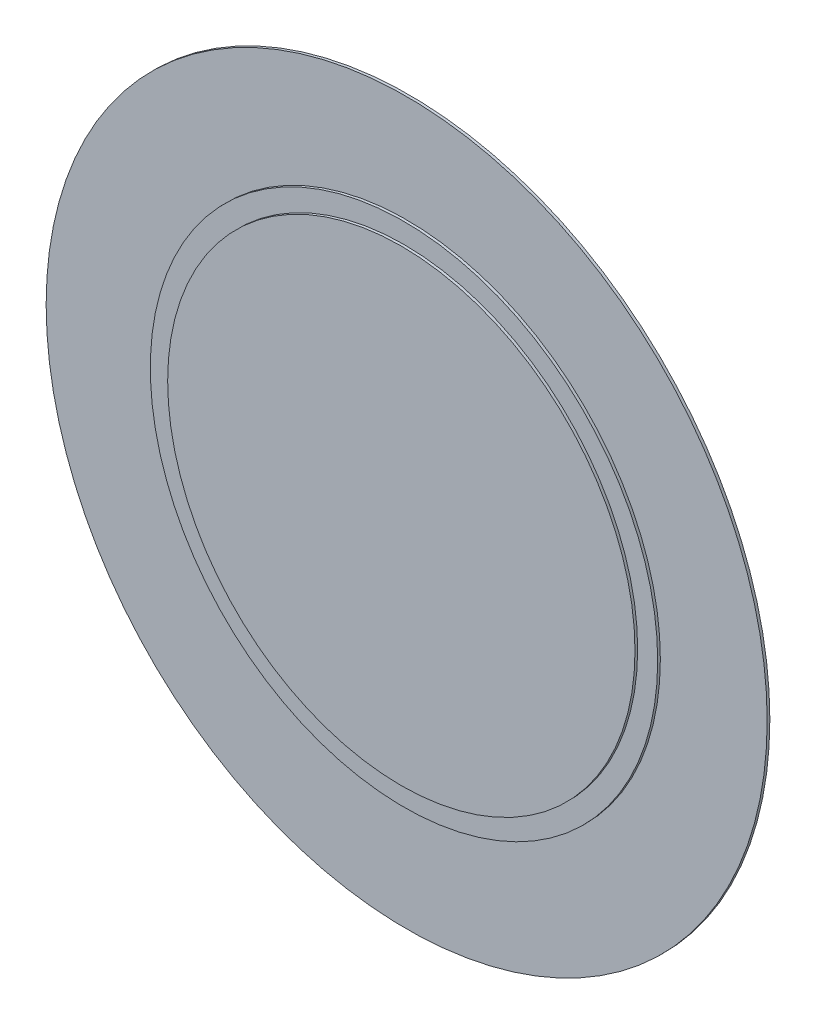
ISO-10303-21;
HEADER;
FILE_DESCRIPTION(('STEP AP214'),'2;1');
FILE_NAME('part.step','',(''),(''),'','','');
FILE_SCHEMA(('AUTOMOTIVE_DESIGN { 1 0 10303 214 1 1 1 1 }'));
ENDSEC;
DATA;
#1=APPLICATION_CONTEXT('core data for automotive mechanical design processes');
#2=APPLICATION_PROTOCOL_DEFINITION('international standard','automotive_design',2000,#1);
#3=PRODUCT_CONTEXT('',#1,'mechanical');
#4=PRODUCT('Part','Part','',(#3));
#5=PRODUCT_RELATED_PRODUCT_CATEGORY('part','',(#4));
#6=PRODUCT_DEFINITION_FORMATION('','',#4);
#7=PRODUCT_DEFINITION_CONTEXT('part definition',#1,'design');
#8=PRODUCT_DEFINITION('design','',#6,#7);
#9=PRODUCT_DEFINITION_SHAPE('','',#8);
#10=(LENGTH_UNIT() NAMED_UNIT(*) SI_UNIT(.MILLI.,.METRE.));
#11=(NAMED_UNIT(*) PLANE_ANGLE_UNIT() SI_UNIT($,.RADIAN.));
#12=(NAMED_UNIT(*) SI_UNIT($,.STERADIAN.) SOLID_ANGLE_UNIT());
#13=UNCERTAINTY_MEASURE_WITH_UNIT(LENGTH_MEASURE(1.E-05),#10,'distance_accuracy_value','');
#14=(GEOMETRIC_REPRESENTATION_CONTEXT(3) GLOBAL_UNCERTAINTY_ASSIGNED_CONTEXT((#13)) GLOBAL_UNIT_ASSIGNED_CONTEXT((#10,
#11,#12)) REPRESENTATION_CONTEXT('',''));
#15=CARTESIAN_POINT('',(0.,0.,0.));
#16=DIRECTION('',(0.,0.,1.));
#17=DIRECTION('',(1.,0.,0.));
#18=AXIS2_PLACEMENT_3D('',#15,#16,#17);
#19=CARTESIAN_POINT('',(0.,0.,0.));
#20=DIRECTION('',(0.,0.,1.));
#21=DIRECTION('',(1.,0.,0.));
#22=AXIS2_PLACEMENT_3D('',#19,#20,#21);
#23=PLANE('',#22);
#24=CARTESIAN_POINT('',(0.,0.,0.));
#25=DIRECTION('',(0.,0.,1.));
#26=DIRECTION('',(1.,0.,0.));
#27=AXIS2_PLACEMENT_3D('',#24,#25,#26);
#28=CIRCLE('',#27,13.5);
#29=CARTESIAN_POINT('',(-13.5,0.,0.));
#30=VERTEX_POINT('',#29);
#31=EDGE_CURVE('P0_E10',#30,#30,#28,.T.);
#32=ORIENTED_EDGE('',*,*,#31,.F.);
#33=EDGE_LOOP('',(#32));
#34=FACE_BOUND('',#33,.T.);
#35=ADVANCED_FACE('P0_F16',(#34),#23,.F.);
#36=CARTESIAN_POINT('',(0.,0.,0.1));
#37=DIRECTION('',(0.,0.,1.));
#38=DIRECTION('',(1.,0.,0.));
#39=AXIS2_PLACEMENT_3D('',#36,#37,#38);
#40=PLANE('',#39);
#41=CARTESIAN_POINT('',(0.,0.,0.1));
#42=DIRECTION('',(0.,0.,1.));
#43=DIRECTION('',(1.,0.,0.));
#44=AXIS2_PLACEMENT_3D('',#41,#42,#43);
#45=CIRCLE('',#44,13.5);
#46=CARTESIAN_POINT('',(-13.5,0.,0.1));
#47=VERTEX_POINT('',#46);
#48=EDGE_CURVE('P0_E37',#47,#47,#45,.T.);
#49=ORIENTED_EDGE('',*,*,#48,.T.);
#50=EDGE_LOOP('',(#49));
#51=FACE_BOUND('',#50,.T.);
#52=ADVANCED_FACE('P0_F43',(#51),#40,.T.);
#53=CARTESIAN_POINT('',(0.,0.,0.));
#54=DIRECTION('',(0.,0.,1.));
#55=DIRECTION('',(1.,0.,0.));
#56=AXIS2_PLACEMENT_3D('',#53,#54,#55);
#57=CYLINDRICAL_SURFACE('',#56,13.5);
#58=ORIENTED_EDGE('',*,*,#48,.F.);
#59=DIRECTION('',(0.,0.,-1.));
#60=VECTOR('',#59,1.);
#61=CARTESIAN_POINT('',(-13.5,0.,0.));
#62=LINE('',#61,#60);
#63=EDGE_CURVE('P0_E24',#47,#30,#62,.T.);
#64=ORIENTED_EDGE('',*,*,#63,.T.);
#65=ORIENTED_EDGE('',*,*,#31,.T.);
#66=ORIENTED_EDGE('',*,*,#63,.F.);
#67=EDGE_LOOP('',(#58,#64,#65,#66));
#68=FACE_BOUND('',#67,.T.);
#69=ADVANCED_FACE('P0_F39',(#68),#57,.T.);
#70=CLOSED_SHELL('',(#35,#52,#69));
#71=MANIFOLD_SOLID_BREP('P0_B1',#70);
#72=CARTESIAN_POINT('',(0.,0.,0.1));
#73=DIRECTION('',(0.,0.,1.));
#74=DIRECTION('',(1.,0.,0.));
#75=AXIS2_PLACEMENT_3D('',#72,#73,#74);
#76=PLANE('',#75);
#77=CARTESIAN_POINT('',(0.,0.,0.1));
#78=DIRECTION('',(0.,0.,1.));
#79=DIRECTION('',(-1.,0.,0.));
#80=AXIS2_PLACEMENT_3D('',#77,#78,#79);
#81=CIRCLE('',#80,9.5);
#82=CARTESIAN_POINT('',(9.5,0.,0.1));
#83=VERTEX_POINT('',#82);
#84=EDGE_CURVE('P1_E11',#83,#83,#81,.T.);
#85=ORIENTED_EDGE('',*,*,#84,.F.);
#86=EDGE_LOOP('',(#85));
#87=FACE_BOUND('',#86,.T.);
#88=ADVANCED_FACE('P1_F17',(#87),#76,.F.);
#89=CARTESIAN_POINT('',(0.,0.,0.2));
#90=DIRECTION('',(0.,0.,1.));
#91=DIRECTION('',(1.,0.,0.));
#92=AXIS2_PLACEMENT_3D('',#89,#90,#91);
#93=PLANE('',#92);
#94=CARTESIAN_POINT('',(0.,0.,0.2));
#95=DIRECTION('',(0.,0.,1.));
#96=DIRECTION('',(-1.,0.,0.));
#97=AXIS2_PLACEMENT_3D('',#94,#95,#96);
#98=CIRCLE('',#97,9.5);
#99=CARTESIAN_POINT('',(9.5,0.,0.2));
#100=VERTEX_POINT('',#99);
#101=EDGE_CURVE('P1_E41',#100,#100,#98,.T.);
#102=ORIENTED_EDGE('',*,*,#101,.T.);
#103=EDGE_LOOP('',(#102));
#104=FACE_BOUND('',#103,.T.);
#105=ADVANCED_FACE('P1_F42',(#104),#93,.T.);
#106=CARTESIAN_POINT('',(0.,0.,0.1));
#107=DIRECTION('',(0.,0.,1.));
#108=DIRECTION('',(-1.,0.,0.));
#109=AXIS2_PLACEMENT_3D('',#106,#107,#108);
#110=CYLINDRICAL_SURFACE('',#109,9.5);
#111=ORIENTED_EDGE('',*,*,#101,.F.);
#112=DIRECTION('',(0.,0.,-1.));
#113=VECTOR('',#112,1.);
#114=CARTESIAN_POINT('',(9.5,0.,0.1));
#115=LINE('',#114,#113);
#116=EDGE_CURVE('P1_E25',#100,#83,#115,.T.);
#117=ORIENTED_EDGE('',*,*,#116,.T.);
#118=ORIENTED_EDGE('',*,*,#84,.T.);
#119=ORIENTED_EDGE('',*,*,#116,.F.);
#120=EDGE_LOOP('',(#111,#117,#118,#119));
#121=FACE_BOUND('',#120,.T.);
#122=ADVANCED_FACE('P1_F37',(#121),#110,.T.);
#123=CLOSED_SHELL('',(#88,#105,#122));
#124=MANIFOLD_SOLID_BREP('P1_B1',#123);
#125=CARTESIAN_POINT('',(0.,0.,0.2));
#126=DIRECTION('',(0.,0.,1.));
#127=DIRECTION('',(1.,0.,0.));
#128=AXIS2_PLACEMENT_3D('',#125,#126,#127);
#129=PLANE('',#128);
#130=CARTESIAN_POINT('',(0.,0.,0.2));
#131=DIRECTION('',(0.,0.,1.));
#132=DIRECTION('',(-1.,0.,0.));
#133=AXIS2_PLACEMENT_3D('',#130,#131,#132);
#134=CIRCLE('',#133,8.75);
#135=CARTESIAN_POINT('',(8.75,0.,0.2));
#136=VERTEX_POINT('',#135);
#137=EDGE_CURVE('P2_E10',#136,#136,#134,.T.);
#138=ORIENTED_EDGE('',*,*,#137,.F.);
#139=EDGE_LOOP('',(#138));
#140=FACE_BOUND('',#139,.T.);
#141=ADVANCED_FACE('P2_F16',(#140),#129,.F.);
#142=CARTESIAN_POINT('',(0.,0.,0.3));
#143=DIRECTION('',(0.,0.,1.));
#144=DIRECTION('',(1.,0.,0.));
#145=AXIS2_PLACEMENT_3D('',#142,#143,#144);
#146=PLANE('',#145);
#147=CARTESIAN_POINT('',(0.,0.,0.3));
#148=DIRECTION('',(0.,0.,1.));
#149=DIRECTION('',(-1.,0.,0.));
#150=AXIS2_PLACEMENT_3D('',#147,#148,#149);
#151=CIRCLE('',#150,8.75);
#152=CARTESIAN_POINT('',(8.75,0.,0.3));
#153=VERTEX_POINT('',#152);
#154=EDGE_CURVE('P2_E37',#153,#153,#151,.T.);
#155=ORIENTED_EDGE('',*,*,#154,.T.);
#156=EDGE_LOOP('',(#155));
#157=FACE_BOUND('',#156,.T.);
#158=ADVANCED_FACE('P2_F43',(#157),#146,.T.);
#159=CARTESIAN_POINT('',(0.,0.,0.2));
#160=DIRECTION('',(0.,0.,1.));
#161=DIRECTION('',(-1.,0.,0.));
#162=AXIS2_PLACEMENT_3D('',#159,#160,#161);
#163=CYLINDRICAL_SURFACE('',#162,8.75);
#164=ORIENTED_EDGE('',*,*,#154,.F.);
#165=DIRECTION('',(0.,0.,-1.));
#166=VECTOR('',#165,1.);
#167=CARTESIAN_POINT('',(8.75,0.,0.2));
#168=LINE('',#167,#166);
#169=EDGE_CURVE('P2_E24',#153,#136,#168,.T.);
#170=ORIENTED_EDGE('',*,*,#169,.T.);
#171=ORIENTED_EDGE('',*,*,#137,.T.);
#172=ORIENTED_EDGE('',*,*,#169,.F.);
#173=EDGE_LOOP('',(#164,#170,#171,#172));
#174=FACE_BOUND('',#173,.T.);
#175=ADVANCED_FACE('P2_F39',(#174),#163,.T.);
#176=CLOSED_SHELL('',(#141,#158,#175));
#177=MANIFOLD_SOLID_BREP('P2_B1',#176);
#178=ADVANCED_BREP_SHAPE_REPRESENTATION('',(#18,#71,#124,#177),#14);
#179=SHAPE_DEFINITION_REPRESENTATION(#9,#178);
ENDSEC;
END-ISO-10303-21;
